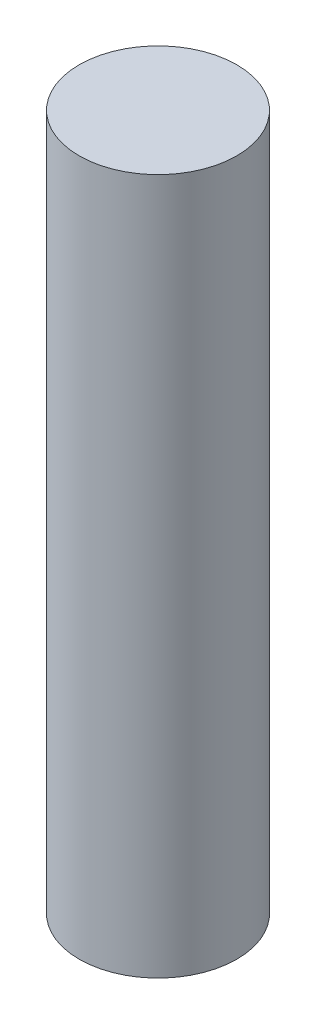
ISO-10303-21;
HEADER;
FILE_DESCRIPTION(('STEP AP214'),'2;1');
FILE_NAME('part.step','',(''),(''),'','','');
FILE_SCHEMA(('AUTOMOTIVE_DESIGN { 1 0 10303 214 1 1 1 1 }'));
ENDSEC;
DATA;
#1=APPLICATION_CONTEXT('core data for automotive mechanical design processes');
#2=APPLICATION_PROTOCOL_DEFINITION('international standard','automotive_design',2000,#1);
#3=PRODUCT_CONTEXT('',#1,'mechanical');
#4=PRODUCT('Part','Part','',(#3));
#5=PRODUCT_RELATED_PRODUCT_CATEGORY('part','',(#4));
#6=PRODUCT_DEFINITION_FORMATION('','',#4);
#7=PRODUCT_DEFINITION_CONTEXT('part definition',#1,'design');
#8=PRODUCT_DEFINITION('design','',#6,#7);
#9=PRODUCT_DEFINITION_SHAPE('','',#8);
#10=(LENGTH_UNIT() NAMED_UNIT(*) SI_UNIT(.MILLI.,.METRE.));
#11=(NAMED_UNIT(*) PLANE_ANGLE_UNIT() SI_UNIT($,.RADIAN.));
#12=(NAMED_UNIT(*) SI_UNIT($,.STERADIAN.) SOLID_ANGLE_UNIT());
#13=UNCERTAINTY_MEASURE_WITH_UNIT(LENGTH_MEASURE(1.E-05),#10,'distance_accuracy_value','');
#14=(GEOMETRIC_REPRESENTATION_CONTEXT(3) GLOBAL_UNCERTAINTY_ASSIGNED_CONTEXT((#13)) GLOBAL_UNIT_ASSIGNED_CONTEXT((#10,
#11,#12)) REPRESENTATION_CONTEXT('',''));
#15=CARTESIAN_POINT('',(0.,0.,0.));
#16=DIRECTION('',(0.,0.,1.));
#17=DIRECTION('',(1.,0.,0.));
#18=AXIS2_PLACEMENT_3D('',#15,#16,#17);
#19=CARTESIAN_POINT('',(0.,30.,0.));
#20=DIRECTION('',(0.,-1.,0.));
#21=DIRECTION('',(0.,0.,-1.));
#22=AXIS2_PLACEMENT_3D('',#19,#20,#21);
#23=CYLINDRICAL_SURFACE('',#22,3.4);
#24=CARTESIAN_POINT('',(0.,30.,0.));
#25=DIRECTION('',(0.,1.,0.));
#26=DIRECTION('',(0.,0.,1.));
#27=AXIS2_PLACEMENT_3D('',#24,#25,#26);
#28=CIRCLE('',#27,3.4);
#29=CARTESIAN_POINT('',(0.,30.,3.4));
#30=VERTEX_POINT('',#29);
#31=EDGE_CURVE('E10',#30,#30,#28,.T.);
#32=ORIENTED_EDGE('',*,*,#31,.F.);
#33=EDGE_LOOP('',(#32));
#34=FACE_BOUND('',#33,.T.);
#35=CARTESIAN_POINT('',(0.,0.,0.));
#36=DIRECTION('',(0.,1.,0.));
#37=DIRECTION('',(0.,0.,1.));
#38=AXIS2_PLACEMENT_3D('',#35,#36,#37);
#39=CIRCLE('',#38,3.4);
#40=CARTESIAN_POINT('',(0.,0.,3.4));
#41=VERTEX_POINT('',#40);
#42=EDGE_CURVE('E44',#41,#41,#39,.T.);
#43=ORIENTED_EDGE('',*,*,#42,.T.);
#44=EDGE_LOOP('',(#43));
#45=FACE_BOUND('',#44,.T.);
#46=ADVANCED_FACE('F41',(#34,#45),#23,.T.);
#47=CARTESIAN_POINT('',(0.,30.,0.));
#48=DIRECTION('',(0.,1.,0.));
#49=DIRECTION('',(0.,0.,1.));
#50=AXIS2_PLACEMENT_3D('',#47,#48,#49);
#51=PLANE('',#50);
#52=ORIENTED_EDGE('',*,*,#31,.T.);
#53=EDGE_LOOP('',(#52));
#54=FACE_BOUND('',#53,.T.);
#55=ADVANCED_FACE('F58',(#54),#51,.T.);
#56=CARTESIAN_POINT('',(0.,0.,0.));
#57=DIRECTION('',(0.,1.,0.));
#58=DIRECTION('',(0.,0.,1.));
#59=AXIS2_PLACEMENT_3D('',#56,#57,#58);
#60=PLANE('',#59);
#61=ORIENTED_EDGE('',*,*,#42,.F.);
#62=EDGE_LOOP('',(#61));
#63=FACE_BOUND('',#62,.T.);
#64=ADVANCED_FACE('F56',(#63),#60,.F.);
#65=CLOSED_SHELL('',(#46,#55,#64));
#66=MANIFOLD_SOLID_BREP('B2',#65);
#67=ADVANCED_BREP_SHAPE_REPRESENTATION('',(#18,#66),#14);
#68=SHAPE_DEFINITION_REPRESENTATION(#9,#67);
ENDSEC;
END-ISO-10303-21;
